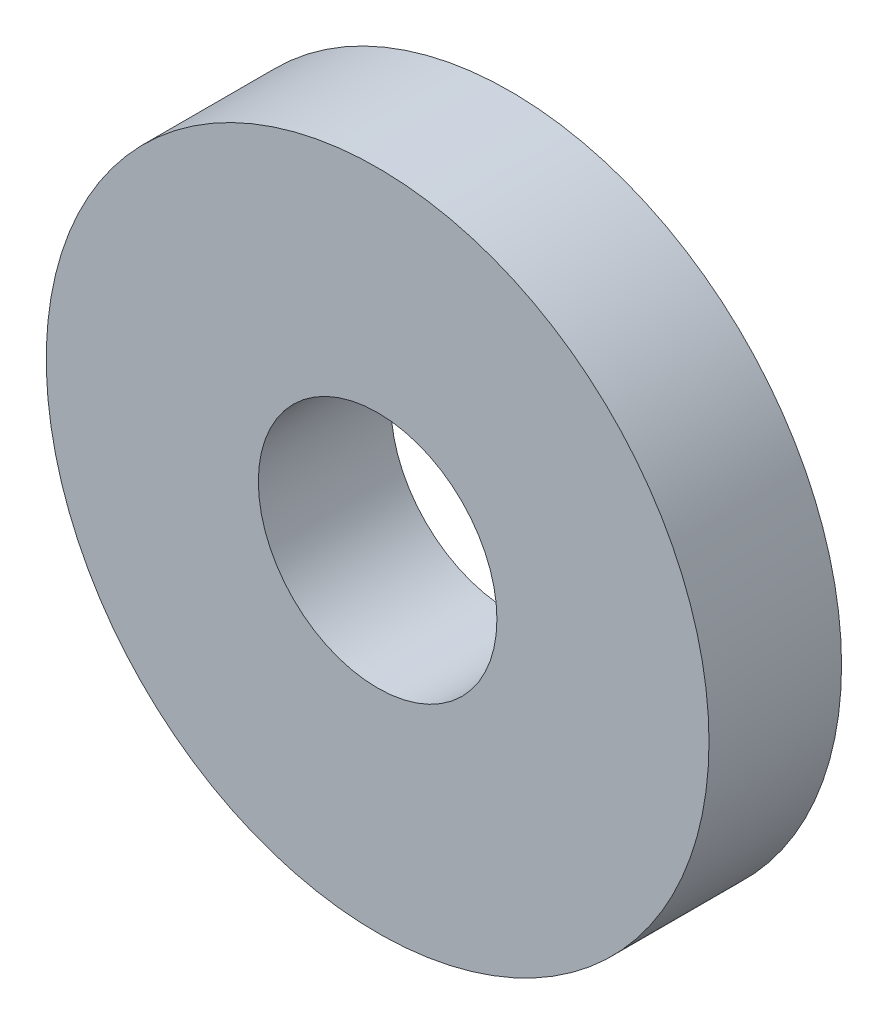
ISO-10303-21;
HEADER;
FILE_DESCRIPTION(('STEP AP214'),'2;1');
FILE_NAME('part.step','',(''),(''),'','','');
FILE_SCHEMA(('AUTOMOTIVE_DESIGN { 1 0 10303 214 1 1 1 1 }'));
ENDSEC;
DATA;
#1=APPLICATION_CONTEXT('core data for automotive mechanical design processes');
#2=APPLICATION_PROTOCOL_DEFINITION('international standard','automotive_design',2000,#1);
#3=PRODUCT_CONTEXT('',#1,'mechanical');
#4=PRODUCT('Part','Part','',(#3));
#5=PRODUCT_RELATED_PRODUCT_CATEGORY('part','',(#4));
#6=PRODUCT_DEFINITION_FORMATION('','',#4);
#7=PRODUCT_DEFINITION_CONTEXT('part definition',#1,'design');
#8=PRODUCT_DEFINITION('design','',#6,#7);
#9=PRODUCT_DEFINITION_SHAPE('','',#8);
#10=(LENGTH_UNIT() NAMED_UNIT(*) SI_UNIT(.MILLI.,.METRE.));
#11=(NAMED_UNIT(*) PLANE_ANGLE_UNIT() SI_UNIT($,.RADIAN.));
#12=(NAMED_UNIT(*) SI_UNIT($,.STERADIAN.) SOLID_ANGLE_UNIT());
#13=UNCERTAINTY_MEASURE_WITH_UNIT(LENGTH_MEASURE(1.E-05),#10,'distance_accuracy_value','');
#14=(GEOMETRIC_REPRESENTATION_CONTEXT(3) GLOBAL_UNCERTAINTY_ASSIGNED_CONTEXT((#13)) GLOBAL_UNIT_ASSIGNED_CONTEXT((#10,
#11,#12)) REPRESENTATION_CONTEXT('',''));
#15=CARTESIAN_POINT('',(0.,0.,0.));
#16=DIRECTION('',(0.,0.,1.));
#17=DIRECTION('',(1.,0.,0.));
#18=AXIS2_PLACEMENT_3D('',#15,#16,#17);
#19=CARTESIAN_POINT('',(0.,0.,5.));
#20=DIRECTION('',(0.,0.,1.));
#21=DIRECTION('',(1.,0.,0.));
#22=AXIS2_PLACEMENT_3D('',#19,#20,#21);
#23=PLANE('',#22);
#24=CARTESIAN_POINT('',(0.,0.,5.));
#25=DIRECTION('',(0.,0.,1.));
#26=DIRECTION('',(1.,0.,0.));
#27=AXIS2_PLACEMENT_3D('',#24,#25,#26);
#28=CIRCLE('',#27,12.5);
#29=CARTESIAN_POINT('',(12.5,0.,5.));
#30=VERTEX_POINT('',#29);
#31=EDGE_CURVE('E10',#30,#30,#28,.T.);
#32=ORIENTED_EDGE('',*,*,#31,.T.);
#33=EDGE_LOOP('',(#32));
#34=FACE_BOUND('',#33,.T.);
#35=CARTESIAN_POINT('',(0.,0.,5.));
#36=DIRECTION('',(0.,0.,1.));
#37=DIRECTION('',(1.,0.,0.));
#38=AXIS2_PLACEMENT_3D('',#35,#36,#37);
#39=CIRCLE('',#38,4.5);
#40=CARTESIAN_POINT('',(4.5,0.,5.));
#41=VERTEX_POINT('',#40);
#42=EDGE_CURVE('E41',#41,#41,#39,.T.);
#43=ORIENTED_EDGE('',*,*,#42,.F.);
#44=EDGE_LOOP('',(#43));
#45=FACE_BOUND('',#44,.T.);
#46=ADVANCED_FACE('F30',(#34,#45),#23,.T.);
#47=CARTESIAN_POINT('',(0.,0.,0.));
#48=DIRECTION('',(0.,0.,1.));
#49=DIRECTION('',(1.,0.,0.));
#50=AXIS2_PLACEMENT_3D('',#47,#48,#49);
#51=PLANE('',#50);
#52=CARTESIAN_POINT('',(0.,0.,0.));
#53=DIRECTION('',(0.,0.,1.));
#54=DIRECTION('',(1.,0.,0.));
#55=AXIS2_PLACEMENT_3D('',#52,#53,#54);
#56=CIRCLE('',#55,12.5);
#57=CARTESIAN_POINT('',(12.5,0.,0.));
#58=VERTEX_POINT('',#57);
#59=EDGE_CURVE('E34',#58,#58,#56,.T.);
#60=ORIENTED_EDGE('',*,*,#59,.F.);
#61=EDGE_LOOP('',(#60));
#62=FACE_BOUND('',#61,.T.);
#63=CARTESIAN_POINT('',(0.,0.,0.));
#64=DIRECTION('',(0.,0.,1.));
#65=DIRECTION('',(1.,0.,0.));
#66=AXIS2_PLACEMENT_3D('',#63,#64,#65);
#67=CIRCLE('',#66,4.5);
#68=CARTESIAN_POINT('',(4.5,0.,0.));
#69=VERTEX_POINT('',#68);
#70=EDGE_CURVE('E43',#69,#69,#67,.T.);
#71=ORIENTED_EDGE('',*,*,#70,.T.);
#72=EDGE_LOOP('',(#71));
#73=FACE_BOUND('',#72,.T.);
#74=ADVANCED_FACE('F53',(#62,#73),#51,.F.);
#75=CARTESIAN_POINT('',(0.,0.,5.));
#76=DIRECTION('',(0.,0.,-1.));
#77=DIRECTION('',(-1.,0.,0.));
#78=AXIS2_PLACEMENT_3D('',#75,#76,#77);
#79=CYLINDRICAL_SURFACE('',#78,12.5);
#80=ORIENTED_EDGE('',*,*,#31,.F.);
#81=EDGE_LOOP('',(#80));
#82=FACE_BOUND('',#81,.T.);
#83=ORIENTED_EDGE('',*,*,#59,.T.);
#84=EDGE_LOOP('',(#83));
#85=FACE_BOUND('',#84,.T.);
#86=ADVANCED_FACE('F32',(#82,#85),#79,.T.);
#87=CARTESIAN_POINT('',(0.,0.,5.));
#88=DIRECTION('',(0.,0.,-1.));
#89=DIRECTION('',(-1.,0.,0.));
#90=AXIS2_PLACEMENT_3D('',#87,#88,#89);
#91=CYLINDRICAL_SURFACE('',#90,4.5);
#92=ORIENTED_EDGE('',*,*,#42,.T.);
#93=EDGE_LOOP('',(#92));
#94=FACE_BOUND('',#93,.T.);
#95=ORIENTED_EDGE('',*,*,#70,.F.);
#96=EDGE_LOOP('',(#95));
#97=FACE_BOUND('',#96,.T.);
#98=ADVANCED_FACE('F49',(#94,#97),#91,.F.);
#99=CLOSED_SHELL('',(#46,#74,#86,#98));
#100=MANIFOLD_SOLID_BREP('B2',#99);
#101=ADVANCED_BREP_SHAPE_REPRESENTATION('',(#18,#100),#14);
#102=SHAPE_DEFINITION_REPRESENTATION(#9,#101);
ENDSEC;
END-ISO-10303-21;
